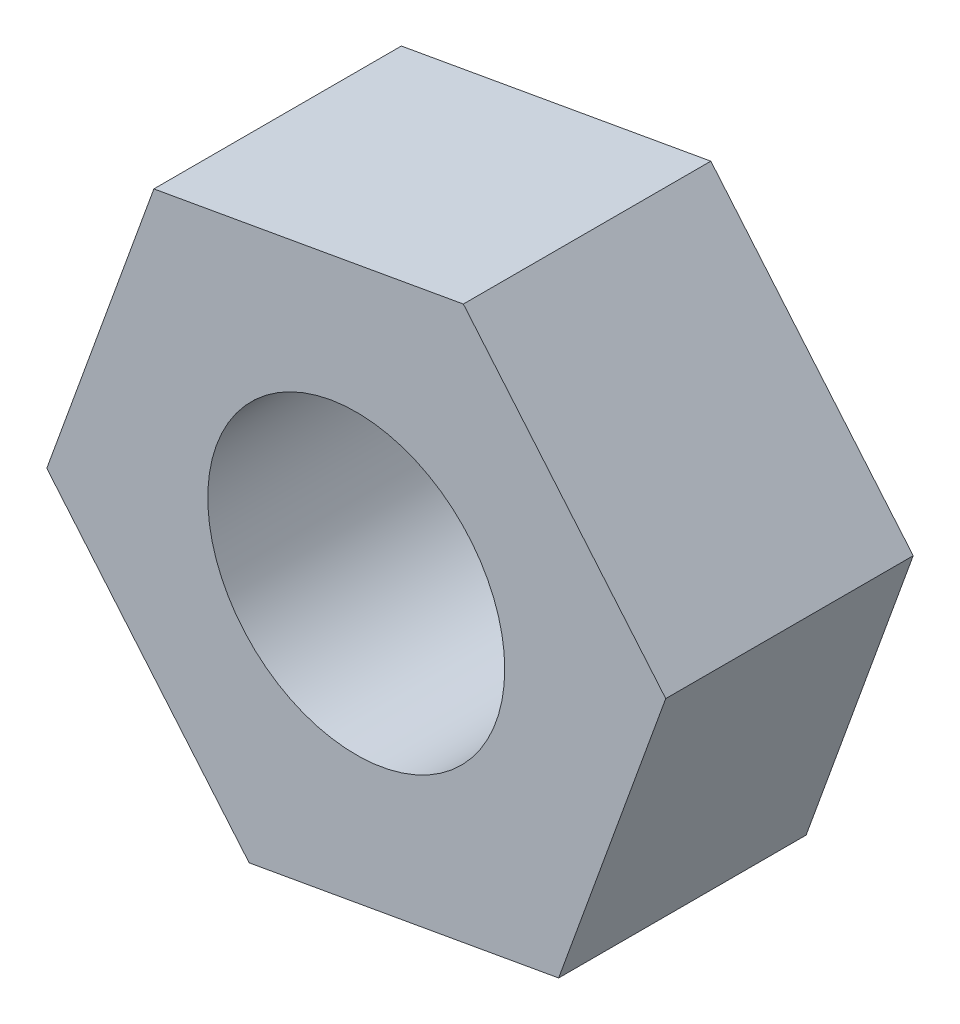
ISO-10303-21;
HEADER;
FILE_DESCRIPTION(('STEP AP214'),'2;1');
FILE_NAME('part.step','',(''),(''),'','','');
FILE_SCHEMA(('AUTOMOTIVE_DESIGN { 1 0 10303 214 1 1 1 1 }'));
ENDSEC;
DATA;
#1=APPLICATION_CONTEXT('core data for automotive mechanical design processes');
#2=APPLICATION_PROTOCOL_DEFINITION('international standard','automotive_design',2000,#1);
#3=PRODUCT_CONTEXT('',#1,'mechanical');
#4=PRODUCT('Part','Part','',(#3));
#5=PRODUCT_RELATED_PRODUCT_CATEGORY('part','',(#4));
#6=PRODUCT_DEFINITION_FORMATION('','',#4);
#7=PRODUCT_DEFINITION_CONTEXT('part definition',#1,'design');
#8=PRODUCT_DEFINITION('design','',#6,#7);
#9=PRODUCT_DEFINITION_SHAPE('','',#8);
#10=(LENGTH_UNIT() NAMED_UNIT(*) SI_UNIT(.MILLI.,.METRE.));
#11=(NAMED_UNIT(*) PLANE_ANGLE_UNIT() SI_UNIT($,.RADIAN.));
#12=(NAMED_UNIT(*) SI_UNIT($,.STERADIAN.) SOLID_ANGLE_UNIT());
#13=UNCERTAINTY_MEASURE_WITH_UNIT(LENGTH_MEASURE(1.E-05),#10,'distance_accuracy_value','');
#14=(GEOMETRIC_REPRESENTATION_CONTEXT(3) GLOBAL_UNCERTAINTY_ASSIGNED_CONTEXT((#13)) GLOBAL_UNIT_ASSIGNED_CONTEXT((#10,
#11,#12)) REPRESENTATION_CONTEXT('',''));
#15=CARTESIAN_POINT('',(0.,0.,0.));
#16=DIRECTION('',(0.,0.,1.));
#17=DIRECTION('',(1.,0.,0.));
#18=AXIS2_PLACEMENT_3D('',#15,#16,#17);
#19=CARTESIAN_POINT('',(0.,0.,2.5));
#20=DIRECTION('',(0.,0.,1.));
#21=DIRECTION('',(1.,0.,0.));
#22=AXIS2_PLACEMENT_3D('',#19,#20,#21);
#23=PLANE('',#22);
#24=DIRECTION('',(0.984566216296223,0.175012473064462,0.));
#25=VECTOR('',#24,1.);
#26=CARTESIAN_POINT('',(-1.08192451661023,-2.98542671551172,2.5));
#27=LINE('',#26,#25);
#28=CARTESIAN_POINT('',(-1.08192451661023,-2.98542671551172,2.5));
#29=VERTEX_POINT('',#28);
#30=CARTESIAN_POINT('',(2.04449311846477,-2.42968747411751,2.5));
#31=VERTEX_POINT('',#30);
#32=EDGE_CURVE('E132',#29,#31,#27,.T.);
#33=ORIENTED_EDGE('',*,*,#32,.T.);
#34=DIRECTION('',(0.340717860495147,0.940165591552685,0.));
#35=VECTOR('',#34,1.);
#36=CARTESIAN_POINT('',(2.04449311846477,-2.42968747411751,2.5));
#37=LINE('',#36,#35);
#38=CARTESIAN_POINT('',(3.126417635075,0.555739241394202,2.5));
#39=VERTEX_POINT('',#38);
#40=EDGE_CURVE('E90',#31,#39,#37,.T.);
#41=ORIENTED_EDGE('',*,*,#40,.T.);
#42=DIRECTION('',(-0.643848355801076,0.765153118488222,0.));
#43=VECTOR('',#42,1.);
#44=CARTESIAN_POINT('',(3.126417635075,0.555739241394202,2.5));
#45=LINE('',#44,#43);
#46=CARTESIAN_POINT('',(1.08192451661023,2.98542671551171,2.5));
#47=VERTEX_POINT('',#46);
#48=EDGE_CURVE('E103',#39,#47,#45,.T.);
#49=ORIENTED_EDGE('',*,*,#48,.T.);
#50=DIRECTION('',(-0.984566216296223,-0.175012473064462,0.));
#51=VECTOR('',#50,1.);
#52=CARTESIAN_POINT('',(1.08192451661023,2.98542671551171,2.5));
#53=LINE('',#52,#51);
#54=CARTESIAN_POINT('',(-2.04449311846477,2.42968747411751,2.5));
#55=VERTEX_POINT('',#54);
#56=EDGE_CURVE('E97',#47,#55,#53,.T.);
#57=ORIENTED_EDGE('',*,*,#56,.T.);
#58=DIRECTION('',(-0.340717860495147,-0.940165591552685,0.));
#59=VECTOR('',#58,1.);
#60=CARTESIAN_POINT('',(-2.04449311846477,2.42968747411751,2.5));
#61=LINE('',#60,#59);
#62=CARTESIAN_POINT('',(-3.126417635075,-0.555739241394202,2.5));
#63=VERTEX_POINT('',#62);
#64=EDGE_CURVE('E101',#55,#63,#61,.T.);
#65=ORIENTED_EDGE('',*,*,#64,.T.);
#66=DIRECTION('',(0.643848355801075,-0.765153118488222,0.));
#67=VECTOR('',#66,1.);
#68=CARTESIAN_POINT('',(-3.126417635075,-0.555739241394202,2.5));
#69=LINE('',#68,#67);
#70=EDGE_CURVE('E53',#63,#29,#69,.T.);
#71=ORIENTED_EDGE('',*,*,#70,.T.);
#72=EDGE_LOOP('',(#33,#41,#49,#57,#65,#71));
#73=FACE_BOUND('',#72,.T.);
#74=CARTESIAN_POINT('',(0.,0.,2.5));
#75=DIRECTION('',(0.,0.,1.));
#76=DIRECTION('',(1.,0.,0.));
#77=AXIS2_PLACEMENT_3D('',#74,#75,#76);
#78=CIRCLE('',#77,1.5);
#79=CARTESIAN_POINT('',(1.5,0.,2.5));
#80=VERTEX_POINT('',#79);
#81=EDGE_CURVE('E125',#80,#80,#78,.T.);
#82=ORIENTED_EDGE('',*,*,#81,.F.);
#83=EDGE_LOOP('',(#82));
#84=FACE_BOUND('',#83,.T.);
#85=ADVANCED_FACE('F36',(#73,#84),#23,.T.);
#86=CARTESIAN_POINT('',(0.,0.,0.));
#87=DIRECTION('',(0.,0.,1.));
#88=DIRECTION('',(1.,0.,0.));
#89=AXIS2_PLACEMENT_3D('',#86,#87,#88);
#90=PLANE('',#89);
#91=DIRECTION('',(0.984566216296223,0.175012473064462,0.));
#92=VECTOR('',#91,1.);
#93=CARTESIAN_POINT('',(-1.08192451661023,-2.98542671551172,0.));
#94=LINE('',#93,#92);
#95=CARTESIAN_POINT('',(-1.08192451661023,-2.98542671551172,0.));
#96=VERTEX_POINT('',#95);
#97=CARTESIAN_POINT('',(2.04449311846477,-2.42968747411751,0.));
#98=VERTEX_POINT('',#97);
#99=EDGE_CURVE('E121',#96,#98,#94,.T.);
#100=ORIENTED_EDGE('',*,*,#99,.F.);
#101=DIRECTION('',(0.643848355801075,-0.765153118488222,0.));
#102=VECTOR('',#101,1.);
#103=CARTESIAN_POINT('',(-3.126417635075,-0.555739241394202,0.));
#104=LINE('',#103,#102);
#105=CARTESIAN_POINT('',(-3.126417635075,-0.555739241394202,0.));
#106=VERTEX_POINT('',#105);
#107=EDGE_CURVE('E82',#106,#96,#104,.T.);
#108=ORIENTED_EDGE('',*,*,#107,.F.);
#109=DIRECTION('',(-0.340717860495147,-0.940165591552685,0.));
#110=VECTOR('',#109,1.);
#111=CARTESIAN_POINT('',(-2.04449311846477,2.42968747411751,0.));
#112=LINE('',#111,#110);
#113=CARTESIAN_POINT('',(-2.04449311846477,2.42968747411751,0.));
#114=VERTEX_POINT('',#113);
#115=EDGE_CURVE('E76',#114,#106,#112,.T.);
#116=ORIENTED_EDGE('',*,*,#115,.F.);
#117=DIRECTION('',(-0.984566216296223,-0.175012473064462,0.));
#118=VECTOR('',#117,1.);
#119=CARTESIAN_POINT('',(1.08192451661023,2.98542671551171,0.));
#120=LINE('',#119,#118);
#121=CARTESIAN_POINT('',(1.08192451661023,2.98542671551171,0.));
#122=VERTEX_POINT('',#121);
#123=EDGE_CURVE('E111',#122,#114,#120,.T.);
#124=ORIENTED_EDGE('',*,*,#123,.F.);
#125=DIRECTION('',(-0.643848355801076,0.765153118488222,0.));
#126=VECTOR('',#125,1.);
#127=CARTESIAN_POINT('',(3.126417635075,0.555739241394202,0.));
#128=LINE('',#127,#126);
#129=CARTESIAN_POINT('',(3.126417635075,0.555739241394202,0.));
#130=VERTEX_POINT('',#129);
#131=EDGE_CURVE('E127',#130,#122,#128,.T.);
#132=ORIENTED_EDGE('',*,*,#131,.F.);
#133=DIRECTION('',(0.340717860495147,0.940165591552685,0.));
#134=VECTOR('',#133,1.);
#135=CARTESIAN_POINT('',(2.04449311846477,-2.42968747411751,0.));
#136=LINE('',#135,#134);
#137=EDGE_CURVE('E124',#98,#130,#136,.T.);
#138=ORIENTED_EDGE('',*,*,#137,.F.);
#139=EDGE_LOOP('',(#100,#108,#116,#124,#132,#138));
#140=FACE_BOUND('',#139,.T.);
#141=CARTESIAN_POINT('',(0.,0.,0.));
#142=DIRECTION('',(0.,0.,1.));
#143=DIRECTION('',(1.,0.,0.));
#144=AXIS2_PLACEMENT_3D('',#141,#142,#143);
#145=CIRCLE('',#144,1.5);
#146=CARTESIAN_POINT('',(1.5,0.,0.));
#147=VERTEX_POINT('',#146);
#148=EDGE_CURVE('E225',#147,#147,#145,.T.);
#149=ORIENTED_EDGE('',*,*,#148,.T.);
#150=EDGE_LOOP('',(#149));
#151=FACE_BOUND('',#150,.T.);
#152=ADVANCED_FACE('F141',(#140,#151),#90,.F.);
#153=CARTESIAN_POINT('',(-1.08192451661023,-2.98542671551172,2.5));
#154=DIRECTION('',(-0.175012473064462,0.984566216296223,0.));
#155=DIRECTION('',(-0.984566216296223,-0.175012473064462,0.));
#156=AXIS2_PLACEMENT_3D('',#153,#154,#155);
#157=PLANE('',#156);
#158=ORIENTED_EDGE('',*,*,#99,.T.);
#159=DIRECTION('',(0.,0.,-1.));
#160=VECTOR('',#159,1.);
#161=CARTESIAN_POINT('',(2.04449311846477,-2.42968747411751,2.5));
#162=LINE('',#161,#160);
#163=EDGE_CURVE('E11',#31,#98,#162,.T.);
#164=ORIENTED_EDGE('',*,*,#163,.F.);
#165=ORIENTED_EDGE('',*,*,#32,.F.);
#166=DIRECTION('',(0.,0.,-1.));
#167=VECTOR('',#166,1.);
#168=CARTESIAN_POINT('',(-1.08192451661023,-2.98542671551172,2.5));
#169=LINE('',#168,#167);
#170=EDGE_CURVE('E117',#29,#96,#169,.T.);
#171=ORIENTED_EDGE('',*,*,#170,.T.);
#172=EDGE_LOOP('',(#158,#164,#165,#171));
#173=FACE_BOUND('',#172,.T.);
#174=ADVANCED_FACE('F38',(#173),#157,.F.);
#175=CARTESIAN_POINT('',(2.04449311846477,-2.42968747411751,2.5));
#176=DIRECTION('',(-0.940165591552685,0.340717860495147,0.));
#177=DIRECTION('',(-0.340717860495147,-0.940165591552685,0.));
#178=AXIS2_PLACEMENT_3D('',#175,#176,#177);
#179=PLANE('',#178);
#180=ORIENTED_EDGE('',*,*,#137,.T.);
#181=DIRECTION('',(0.,0.,-1.));
#182=VECTOR('',#181,1.);
#183=CARTESIAN_POINT('',(3.126417635075,0.555739241394202,2.5));
#184=LINE('',#183,#182);
#185=EDGE_CURVE('E45',#39,#130,#184,.T.);
#186=ORIENTED_EDGE('',*,*,#185,.F.);
#187=ORIENTED_EDGE('',*,*,#40,.F.);
#188=ORIENTED_EDGE('',*,*,#163,.T.);
#189=EDGE_LOOP('',(#180,#186,#187,#188));
#190=FACE_BOUND('',#189,.T.);
#191=ADVANCED_FACE('F166',(#190),#179,.F.);
#192=CARTESIAN_POINT('',(3.126417635075,0.555739241394202,2.5));
#193=DIRECTION('',(-0.765153118488222,-0.643848355801076,0.));
#194=DIRECTION('',(0.643848355801076,-0.765153118488222,0.));
#195=AXIS2_PLACEMENT_3D('',#192,#193,#194);
#196=PLANE('',#195);
#197=ORIENTED_EDGE('',*,*,#131,.T.);
#198=DIRECTION('',(0.,0.,-1.));
#199=VECTOR('',#198,1.);
#200=CARTESIAN_POINT('',(1.08192451661023,2.98542671551171,2.5));
#201=LINE('',#200,#199);
#202=EDGE_CURVE('E112',#47,#122,#201,.T.);
#203=ORIENTED_EDGE('',*,*,#202,.F.);
#204=ORIENTED_EDGE('',*,*,#48,.F.);
#205=ORIENTED_EDGE('',*,*,#185,.T.);
#206=EDGE_LOOP('',(#197,#203,#204,#205));
#207=FACE_BOUND('',#206,.T.);
#208=ADVANCED_FACE('F138',(#207),#196,.F.);
#209=CARTESIAN_POINT('',(1.08192451661023,2.98542671551171,2.5));
#210=DIRECTION('',(0.175012473064462,-0.984566216296223,0.));
#211=DIRECTION('',(0.984566216296223,0.175012473064462,0.));
#212=AXIS2_PLACEMENT_3D('',#209,#210,#211);
#213=PLANE('',#212);
#214=ORIENTED_EDGE('',*,*,#123,.T.);
#215=DIRECTION('',(0.,0.,-1.));
#216=VECTOR('',#215,1.);
#217=CARTESIAN_POINT('',(-2.04449311846477,2.42968747411751,2.5));
#218=LINE('',#217,#216);
#219=EDGE_CURVE('E108',#55,#114,#218,.T.);
#220=ORIENTED_EDGE('',*,*,#219,.F.);
#221=ORIENTED_EDGE('',*,*,#56,.F.);
#222=ORIENTED_EDGE('',*,*,#202,.T.);
#223=EDGE_LOOP('',(#214,#220,#221,#222));
#224=FACE_BOUND('',#223,.T.);
#225=ADVANCED_FACE('F109',(#224),#213,.F.);
#226=CARTESIAN_POINT('',(-2.04449311846477,2.42968747411751,2.5));
#227=DIRECTION('',(0.940165591552685,-0.340717860495147,0.));
#228=DIRECTION('',(0.340717860495147,0.940165591552685,0.));
#229=AXIS2_PLACEMENT_3D('',#226,#227,#228);
#230=PLANE('',#229);
#231=ORIENTED_EDGE('',*,*,#115,.T.);
#232=DIRECTION('',(0.,0.,-1.));
#233=VECTOR('',#232,1.);
#234=CARTESIAN_POINT('',(-3.126417635075,-0.555739241394202,2.5));
#235=LINE('',#234,#233);
#236=EDGE_CURVE('E113',#63,#106,#235,.T.);
#237=ORIENTED_EDGE('',*,*,#236,.F.);
#238=ORIENTED_EDGE('',*,*,#64,.F.);
#239=ORIENTED_EDGE('',*,*,#219,.T.);
#240=EDGE_LOOP('',(#231,#237,#238,#239));
#241=FACE_BOUND('',#240,.T.);
#242=ADVANCED_FACE('F115',(#241),#230,.F.);
#243=CARTESIAN_POINT('',(-3.126417635075,-0.555739241394202,2.5));
#244=DIRECTION('',(0.765153118488222,0.643848355801075,0.));
#245=DIRECTION('',(-0.643848355801075,0.765153118488222,0.));
#246=AXIS2_PLACEMENT_3D('',#243,#244,#245);
#247=PLANE('',#246);
#248=ORIENTED_EDGE('',*,*,#107,.T.);
#249=ORIENTED_EDGE('',*,*,#170,.F.);
#250=ORIENTED_EDGE('',*,*,#70,.F.);
#251=ORIENTED_EDGE('',*,*,#236,.T.);
#252=EDGE_LOOP('',(#248,#249,#250,#251));
#253=FACE_BOUND('',#252,.T.);
#254=ADVANCED_FACE('F146',(#253),#247,.F.);
#255=CARTESIAN_POINT('',(0.,0.,2.5));
#256=DIRECTION('',(0.,0.,-1.));
#257=DIRECTION('',(-1.,0.,0.));
#258=AXIS2_PLACEMENT_3D('',#255,#256,#257);
#259=CYLINDRICAL_SURFACE('',#258,1.5);
#260=ORIENTED_EDGE('',*,*,#81,.T.);
#261=EDGE_LOOP('',(#260));
#262=FACE_BOUND('',#261,.T.);
#263=ORIENTED_EDGE('',*,*,#148,.F.);
#264=EDGE_LOOP('',(#263));
#265=FACE_BOUND('',#264,.T.);
#266=ADVANCED_FACE('F148',(#262,#265),#259,.F.);
#267=CLOSED_SHELL('',(#85,#152,#174,#191,#208,#225,#242,#254,#266));
#268=MANIFOLD_SOLID_BREP('B2',#267);
#269=ADVANCED_BREP_SHAPE_REPRESENTATION('',(#18,#268),#14);
#270=SHAPE_DEFINITION_REPRESENTATION(#9,#269);
ENDSEC;
END-ISO-10303-21;
